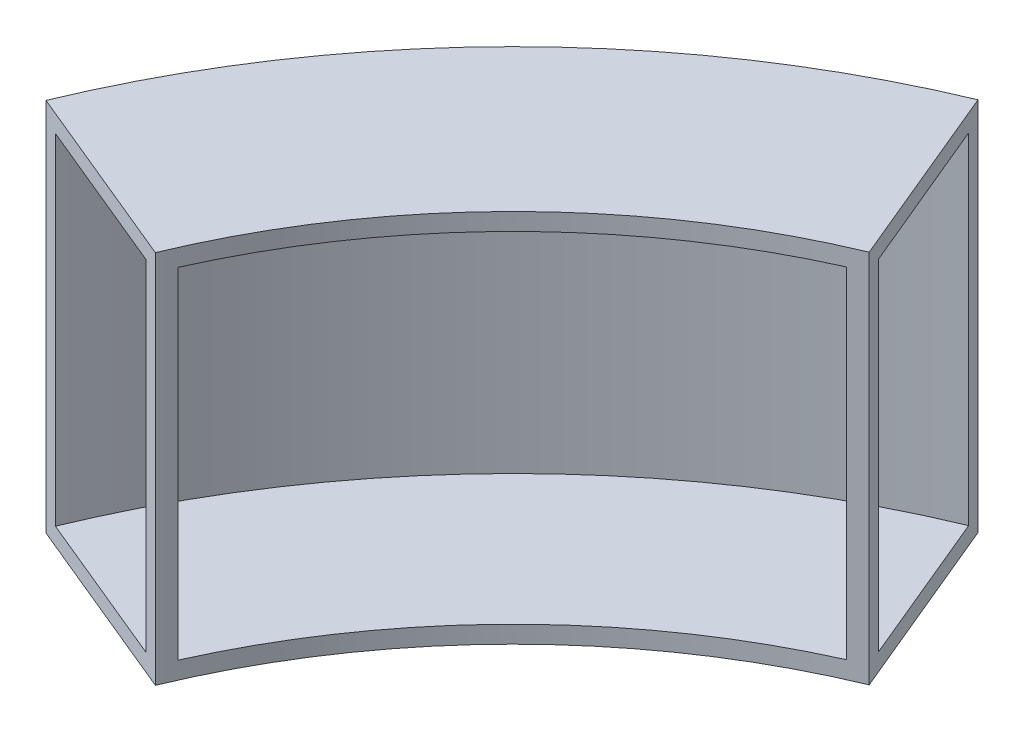
ISO-10303-21;
HEADER;
FILE_DESCRIPTION(('STEP AP214'),'2;1');
FILE_NAME('part.step','',(''),(''),'','','');
FILE_SCHEMA(('AUTOMOTIVE_DESIGN { 1 0 10303 214 1 1 1 1 }'));
ENDSEC;
DATA;
#1=APPLICATION_CONTEXT('core data for automotive mechanical design processes');
#2=APPLICATION_PROTOCOL_DEFINITION('international standard','automotive_design',2000,#1);
#3=PRODUCT_CONTEXT('',#1,'mechanical');
#4=PRODUCT('Part','Part','',(#3));
#5=PRODUCT_RELATED_PRODUCT_CATEGORY('part','',(#4));
#6=PRODUCT_DEFINITION_FORMATION('','',#4);
#7=PRODUCT_DEFINITION_CONTEXT('part definition',#1,'design');
#8=PRODUCT_DEFINITION('design','',#6,#7);
#9=PRODUCT_DEFINITION_SHAPE('','',#8);
#10=(LENGTH_UNIT() NAMED_UNIT(*) SI_UNIT(.MILLI.,.METRE.));
#11=(NAMED_UNIT(*) PLANE_ANGLE_UNIT() SI_UNIT($,.RADIAN.));
#12=(NAMED_UNIT(*) SI_UNIT($,.STERADIAN.) SOLID_ANGLE_UNIT());
#13=UNCERTAINTY_MEASURE_WITH_UNIT(LENGTH_MEASURE(1.E-05),#10,'distance_accuracy_value','');
#14=(GEOMETRIC_REPRESENTATION_CONTEXT(3) GLOBAL_UNCERTAINTY_ASSIGNED_CONTEXT((#13)) GLOBAL_UNIT_ASSIGNED_CONTEXT((#10,
#11,#12)) REPRESENTATION_CONTEXT('',''));
#15=CARTESIAN_POINT('',(0.,0.,0.));
#16=DIRECTION('',(0.,0.,1.));
#17=DIRECTION('',(1.,0.,0.));
#18=AXIS2_PLACEMENT_3D('',#15,#16,#17);
#19=CARTESIAN_POINT('',(0.,650.,0.));
#20=DIRECTION('',(-0.382169076439236,0.,0.924092418004596));
#21=DIRECTION('',(0.924092418004596,0.,0.382169076439236));
#22=AXIS2_PLACEMENT_3D('',#19,#20,#21);
#23=PLANE('',#22);
#24=DIRECTION('',(-0.924092418004596,0.,-0.382169076439236));
#25=VECTOR('',#24,1.);
#26=CARTESIAN_POINT('',(0.,0.,0.));
#27=LINE('',#26,#25);
#28=CARTESIAN_POINT('',(-1058.4838251365,0.,-437.748192709739));
#29=VERTEX_POINT('',#28);
#30=CARTESIAN_POINT('',(-1382.01717482259,0.,-571.549140577935));
#31=VERTEX_POINT('',#30);
#32=EDGE_CURVE('E184',#29,#31,#27,.T.);
#33=ORIENTED_EDGE('',*,*,#32,.F.);
#34=DIRECTION('',(0.,-1.,0.));
#35=VECTOR('',#34,1.);
#36=CARTESIAN_POINT('',(-1058.4838251365,650.,-437.748192709739));
#37=LINE('',#36,#35);
#38=CARTESIAN_POINT('',(-1058.4838251365,650.,-437.748192709739));
#39=VERTEX_POINT('',#38);
#40=EDGE_CURVE('E156',#39,#29,#37,.T.);
#41=ORIENTED_EDGE('',*,*,#40,.F.);
#42=DIRECTION('',(-0.924092418004596,0.,-0.382169076439236));
#43=VECTOR('',#42,1.);
#44=CARTESIAN_POINT('',(0.,650.,0.));
#45=LINE('',#44,#43);
#46=CARTESIAN_POINT('',(-1382.01717482259,650.,-571.549140577935));
#47=VERTEX_POINT('',#46);
#48=EDGE_CURVE('E176',#39,#47,#45,.T.);
#49=ORIENTED_EDGE('',*,*,#48,.T.);
#50=DIRECTION('',(0.,-1.,0.));
#51=VECTOR('',#50,1.);
#52=CARTESIAN_POINT('',(-1382.01717482259,650.,-571.549140577935));
#53=LINE('',#52,#51);
#54=EDGE_CURVE('E168',#47,#31,#53,.T.);
#55=ORIENTED_EDGE('',*,*,#54,.T.);
#56=EDGE_LOOP('',(#33,#41,#49,#55));
#57=FACE_BOUND('',#56,.T.);
#58=DIRECTION('',(0.,-1.,0.));
#59=VECTOR('',#58,1.);
#60=CARTESIAN_POINT('',(-1086.20659767663,30.,-449.213265002916));
#61=LINE('',#60,#59);
#62=CARTESIAN_POINT('',(-1086.20659767663,620.,-449.213265002916));
#63=VERTEX_POINT('',#62);
#64=CARTESIAN_POINT('',(-1086.20659767663,30.,-449.213265002916));
#65=VERTEX_POINT('',#64);
#66=EDGE_CURVE('E239',#63,#65,#61,.T.);
#67=ORIENTED_EDGE('',*,*,#66,.T.);
#68=DIRECTION('',(0.924092418004596,0.,0.382169076439236));
#69=VECTOR('',#68,1.);
#70=CARTESIAN_POINT('',(0.,30.,0.));
#71=LINE('',#70,#69);
#72=CARTESIAN_POINT('',(-1354.29440228246,30.,-560.084068284758));
#73=VERTEX_POINT('',#72);
#74=EDGE_CURVE('E188',#73,#65,#71,.T.);
#75=ORIENTED_EDGE('',*,*,#74,.F.);
#76=DIRECTION('',(0.,-1.,0.));
#77=VECTOR('',#76,1.);
#78=CARTESIAN_POINT('',(-1354.29440228246,0.,-560.084068284758));
#79=LINE('',#78,#77);
#80=CARTESIAN_POINT('',(-1354.29440228246,620.,-560.084068284758));
#81=VERTEX_POINT('',#80);
#82=EDGE_CURVE('E202',#81,#73,#79,.T.);
#83=ORIENTED_EDGE('',*,*,#82,.F.);
#84=DIRECTION('',(-0.924092418004596,0.,-0.382169076439236));
#85=VECTOR('',#84,1.);
#86=CARTESIAN_POINT('',(0.,620.,0.));
#87=LINE('',#86,#85);
#88=EDGE_CURVE('E205',#63,#81,#87,.T.);
#89=ORIENTED_EDGE('',*,*,#88,.F.);
#90=EDGE_LOOP('',(#67,#75,#83,#89));
#91=FACE_BOUND('',#90,.T.);
#92=ADVANCED_FACE('F40',(#57,#91),#23,.T.);
#93=CARTESIAN_POINT('',(0.,650.,0.));
#94=DIRECTION('',(0.,-1.,0.));
#95=DIRECTION('',(0.,0.,-1.));
#96=AXIS2_PLACEMENT_3D('',#93,#94,#95);
#97=CYLINDRICAL_SURFACE('',#96,1145.43069990997);
#98=DIRECTION('',(0.,-1.,0.));
#99=VECTOR('',#98,1.);
#100=CARTESIAN_POINT('',(-467.635492961688,30.,-1045.62351447293));
#101=LINE('',#100,#99);
#102=CARTESIAN_POINT('',(-467.635492961688,620.,-1045.62351447293));
#103=VERTEX_POINT('',#102);
#104=CARTESIAN_POINT('',(-467.635492961688,30.,-1045.62351447293));
#105=VERTEX_POINT('',#104);
#106=EDGE_CURVE('E135',#103,#105,#101,.T.);
#107=ORIENTED_EDGE('',*,*,#106,.T.);
#108=CARTESIAN_POINT('',(0.,30.,0.));
#109=DIRECTION('',(0.,1.,0.));
#110=DIRECTION('',(0.,0.,1.));
#111=AXIS2_PLACEMENT_3D('',#108,#109,#110);
#112=CIRCLE('',#111,1145.43069990996);
#113=CARTESIAN_POINT('',(-1046.66219735342,30.,-465.30606371242));
#114=VERTEX_POINT('',#113);
#115=EDGE_CURVE('E217',#105,#114,#112,.T.);
#116=ORIENTED_EDGE('',*,*,#115,.T.);
#117=DIRECTION('',(0.,1.,0.));
#118=VECTOR('',#117,1.);
#119=CARTESIAN_POINT('',(-1046.66219735342,620.,-465.30606371242));
#120=LINE('',#119,#118);
#121=CARTESIAN_POINT('',(-1046.66219735342,620.,-465.30606371242));
#122=VERTEX_POINT('',#121);
#123=EDGE_CURVE('E226',#114,#122,#120,.T.);
#124=ORIENTED_EDGE('',*,*,#123,.T.);
#125=CARTESIAN_POINT('',(0.,620.,0.));
#126=DIRECTION('',(0.,1.,0.));
#127=DIRECTION('',(0.,0.,1.));
#128=AXIS2_PLACEMENT_3D('',#125,#126,#127);
#129=CIRCLE('',#128,1145.43069990996);
#130=EDGE_CURVE('E214',#103,#122,#129,.T.);
#131=ORIENTED_EDGE('',*,*,#130,.F.);
#132=EDGE_LOOP('',(#107,#116,#124,#131));
#133=FACE_BOUND('',#132,.T.);
#134=CARTESIAN_POINT('',(0.,0.,0.));
#135=DIRECTION('',(0.,1.,0.));
#136=DIRECTION('',(0.,0.,1.));
#137=AXIS2_PLACEMENT_3D('',#134,#135,#136);
#138=CIRCLE('',#137,1145.43069990997);
#139=CARTESIAN_POINT('',(-440.104013269852,0.,-1057.50647553573));
#140=VERTEX_POINT('',#139);
#141=EDGE_CURVE('E180',#29,#140,#138,.F.);
#142=ORIENTED_EDGE('',*,*,#141,.T.);
#143=DIRECTION('',(0.,-1.,0.));
#144=VECTOR('',#143,1.);
#145=CARTESIAN_POINT('',(-440.104013269852,650.,-1057.50647553573));
#146=LINE('',#145,#144);
#147=CARTESIAN_POINT('',(-440.104013269852,650.,-1057.50647553573));
#148=VERTEX_POINT('',#147);
#149=EDGE_CURVE('E161',#148,#140,#146,.T.);
#150=ORIENTED_EDGE('',*,*,#149,.F.);
#151=CARTESIAN_POINT('',(0.,650.,0.));
#152=DIRECTION('',(0.,1.,0.));
#153=DIRECTION('',(0.,0.,1.));
#154=AXIS2_PLACEMENT_3D('',#151,#152,#153);
#155=CIRCLE('',#154,1145.43069990997);
#156=EDGE_CURVE('E194',#39,#148,#155,.F.);
#157=ORIENTED_EDGE('',*,*,#156,.F.);
#158=ORIENTED_EDGE('',*,*,#40,.T.);
#159=EDGE_LOOP('',(#142,#150,#157,#158));
#160=FACE_BOUND('',#159,.T.);
#161=ADVANCED_FACE('F257',(#133,#160),#97,.F.);
#162=CARTESIAN_POINT('',(0.,650.,0.));
#163=DIRECTION('',(-0.923239158526879,0.,0.384225787997865));
#164=DIRECTION('',(0.384225787997865,0.,0.923239158526879));
#165=AXIS2_PLACEMENT_3D('',#162,#163,#164);
#166=PLANE('',#165);
#167=DIRECTION('',(0.384225787997865,0.,0.923239158526879));
#168=VECTOR('',#167,1.);
#169=CARTESIAN_POINT('',(0.,30.,0.));
#170=LINE('',#169,#168);
#171=CARTESIAN_POINT('',(-563.09826134239,30.,-1353.04391638748));
#172=VERTEX_POINT('',#171);
#173=CARTESIAN_POINT('',(-451.630786909788,30.,-1085.20365029154));
#174=VERTEX_POINT('',#173);
#175=EDGE_CURVE('E12',#172,#174,#170,.T.);
#176=ORIENTED_EDGE('',*,*,#175,.T.);
#177=DIRECTION('',(0.,1.,0.));
#178=VECTOR('',#177,1.);
#179=CARTESIAN_POINT('',(-451.630786909788,620.,-1085.20365029154));
#180=LINE('',#179,#178);
#181=CARTESIAN_POINT('',(-451.630786909788,620.,-1085.20365029154));
#182=VERTEX_POINT('',#181);
#183=EDGE_CURVE('E54',#174,#182,#180,.T.);
#184=ORIENTED_EDGE('',*,*,#183,.T.);
#185=DIRECTION('',(-0.384225787997865,0.,-0.923239158526879));
#186=VECTOR('',#185,1.);
#187=CARTESIAN_POINT('',(0.,620.,0.));
#188=LINE('',#187,#186);
#189=CARTESIAN_POINT('',(-563.09826134239,620.,-1353.04391638748));
#190=VERTEX_POINT('',#189);
#191=EDGE_CURVE('E150',#182,#190,#188,.T.);
#192=ORIENTED_EDGE('',*,*,#191,.T.);
#193=DIRECTION('',(0.,-1.,0.));
#194=VECTOR('',#193,1.);
#195=CARTESIAN_POINT('',(-563.09826134239,0.,-1353.04391638748));
#196=LINE('',#195,#194);
#197=EDGE_CURVE('E48',#190,#172,#196,.T.);
#198=ORIENTED_EDGE('',*,*,#197,.T.);
#199=EDGE_LOOP('',(#176,#184,#192,#198));
#200=FACE_BOUND('',#199,.T.);
#201=ORIENTED_EDGE('',*,*,#149,.T.);
#202=DIRECTION('',(-0.384225787997865,0.,-0.923239158526879));
#203=VECTOR('',#202,1.);
#204=CARTESIAN_POINT('',(0.,0.,0.));
#205=LINE('',#204,#203);
#206=CARTESIAN_POINT('',(-574.625034982326,0.,-1380.74109114329));
#207=VERTEX_POINT('',#206);
#208=EDGE_CURVE('E177',#140,#207,#205,.T.);
#209=ORIENTED_EDGE('',*,*,#208,.T.);
#210=DIRECTION('',(0.,-1.,0.));
#211=VECTOR('',#210,1.);
#212=CARTESIAN_POINT('',(-574.625034982326,650.,-1380.74109114329));
#213=LINE('',#212,#211);
#214=CARTESIAN_POINT('',(-574.625034982326,650.,-1380.74109114329));
#215=VERTEX_POINT('',#214);
#216=EDGE_CURVE('E164',#215,#207,#213,.T.);
#217=ORIENTED_EDGE('',*,*,#216,.F.);
#218=DIRECTION('',(-0.384225787997865,0.,-0.923239158526879));
#219=VECTOR('',#218,1.);
#220=CARTESIAN_POINT('',(0.,650.,0.));
#221=LINE('',#220,#219);
#222=EDGE_CURVE('E191',#148,#215,#221,.T.);
#223=ORIENTED_EDGE('',*,*,#222,.F.);
#224=EDGE_LOOP('',(#201,#209,#217,#223));
#225=FACE_BOUND('',#224,.T.);
#226=ADVANCED_FACE('F147',(#200,#225),#166,.F.);
#227=CARTESIAN_POINT('',(0.,650.,0.));
#228=DIRECTION('',(0.,-1.,0.));
#229=DIRECTION('',(0.,0.,-1.));
#230=AXIS2_PLACEMENT_3D('',#227,#228,#229);
#231=CYLINDRICAL_SURFACE('',#230,1495.54);
#232=CARTESIAN_POINT('',(0.,0.,0.));
#233=DIRECTION('',(0.,1.,0.));
#234=DIRECTION('',(0.,0.,1.));
#235=AXIS2_PLACEMENT_3D('',#232,#233,#234);
#236=CIRCLE('',#235,1495.54);
#237=EDGE_CURVE('E172',#207,#31,#236,.T.);
#238=ORIENTED_EDGE('',*,*,#237,.T.);
#239=ORIENTED_EDGE('',*,*,#54,.F.);
#240=CARTESIAN_POINT('',(0.,650.,0.));
#241=DIRECTION('',(0.,1.,0.));
#242=DIRECTION('',(0.,0.,1.));
#243=AXIS2_PLACEMENT_3D('',#240,#241,#242);
#244=CIRCLE('',#243,1495.54);
#245=EDGE_CURVE('E171',#215,#47,#244,.T.);
#246=ORIENTED_EDGE('',*,*,#245,.F.);
#247=ORIENTED_EDGE('',*,*,#216,.T.);
#248=EDGE_LOOP('',(#238,#239,#246,#247));
#249=FACE_BOUND('',#248,.T.);
#250=ADVANCED_FACE('F306',(#249),#231,.T.);
#251=CARTESIAN_POINT('',(0.,650.,0.));
#252=DIRECTION('',(0.,1.,0.));
#253=DIRECTION('',(0.,0.,1.));
#254=AXIS2_PLACEMENT_3D('',#251,#252,#253);
#255=PLANE('',#254);
#256=ORIENTED_EDGE('',*,*,#48,.F.);
#257=ORIENTED_EDGE('',*,*,#156,.T.);
#258=ORIENTED_EDGE('',*,*,#222,.T.);
#259=ORIENTED_EDGE('',*,*,#245,.T.);
#260=EDGE_LOOP('',(#256,#257,#258,#259));
#261=FACE_BOUND('',#260,.T.);
#262=ADVANCED_FACE('F302',(#261),#255,.T.);
#263=CARTESIAN_POINT('',(0.,0.,0.));
#264=DIRECTION('',(0.,1.,0.));
#265=DIRECTION('',(0.,0.,1.));
#266=AXIS2_PLACEMENT_3D('',#263,#264,#265);
#267=PLANE('',#266);
#268=ORIENTED_EDGE('',*,*,#32,.T.);
#269=ORIENTED_EDGE('',*,*,#237,.F.);
#270=ORIENTED_EDGE('',*,*,#208,.F.);
#271=ORIENTED_EDGE('',*,*,#141,.F.);
#272=EDGE_LOOP('',(#268,#269,#270,#271));
#273=FACE_BOUND('',#272,.T.);
#274=ADVANCED_FACE('F284',(#273),#267,.F.);
#275=CARTESIAN_POINT('',(-1086.20659767663,30.,-449.213265002916));
#276=DIRECTION('',(0.,-1.,0.));
#277=DIRECTION('',(0.,0.,-1.));
#278=AXIS2_PLACEMENT_3D('',#275,#276,#277);
#279=PLANE('',#278);
#280=DIRECTION('',(-0.408261707145133,0.,-0.912864928934693));
#281=VECTOR('',#280,1.);
#282=CARTESIAN_POINT('',(-479.883344176042,30.,-1073.00946234097));
#283=LINE('',#282,#281);
#284=CARTESIAN_POINT('',(-479.883344176042,30.,-1073.00946234097));
#285=VERTEX_POINT('',#284);
#286=EDGE_CURVE('E142',#105,#285,#283,.T.);
#287=ORIENTED_EDGE('',*,*,#286,.T.);
#288=CARTESIAN_POINT('',(0.,30.,0.));
#289=DIRECTION('',(0.,-1.,0.));
#290=DIRECTION('',(0.,0.,-1.));
#291=AXIS2_PLACEMENT_3D('',#288,#289,#290);
#292=CIRCLE('',#291,1175.43069990997);
#293=EDGE_CURVE('E129',#285,#174,#292,.T.);
#294=ORIENTED_EDGE('',*,*,#293,.T.);
#295=ORIENTED_EDGE('',*,*,#175,.F.);
#296=CARTESIAN_POINT('',(0.,30.,0.));
#297=DIRECTION('',(0.,-1.,0.));
#298=DIRECTION('',(0.,0.,-1.));
#299=AXIS2_PLACEMENT_3D('',#296,#297,#298);
#300=CIRCLE('',#299,1465.54);
#301=EDGE_CURVE('E208',#73,#172,#300,.T.);
#302=ORIENTED_EDGE('',*,*,#301,.F.);
#303=ORIENTED_EDGE('',*,*,#74,.T.);
#304=CARTESIAN_POINT('',(0.,30.,0.));
#305=DIRECTION('',(0.,1.,0.));
#306=DIRECTION('',(0.,0.,1.));
#307=AXIS2_PLACEMENT_3D('',#304,#305,#306);
#308=CIRCLE('',#307,1175.43069990996);
#309=CARTESIAN_POINT('',(-1074.07534938703,30.,-477.492904795403));
#310=VERTEX_POINT('',#309);
#311=EDGE_CURVE('E62',#310,#65,#308,.T.);
#312=ORIENTED_EDGE('',*,*,#311,.F.);
#313=DIRECTION('',(0.913771734453852,0.,0.406228036099429));
#314=VECTOR('',#313,1.);
#315=CARTESIAN_POINT('',(-1046.66219735342,30.,-465.30606371242));
#316=LINE('',#315,#314);
#317=EDGE_CURVE('E230',#310,#114,#316,.T.);
#318=ORIENTED_EDGE('',*,*,#317,.T.);
#319=ORIENTED_EDGE('',*,*,#115,.F.);
#320=EDGE_LOOP('',(#287,#294,#295,#302,#303,#312,#318,#319));
#321=FACE_BOUND('',#320,.T.);
#322=ADVANCED_FACE('F138',(#321),#279,.F.);
#323=CARTESIAN_POINT('',(0.,0.,0.));
#324=DIRECTION('',(0.,-1.,0.));
#325=DIRECTION('',(0.,0.,-1.));
#326=AXIS2_PLACEMENT_3D('',#323,#324,#325);
#327=CYLINDRICAL_SURFACE('',#326,1465.54);
#328=ORIENTED_EDGE('',*,*,#82,.T.);
#329=ORIENTED_EDGE('',*,*,#301,.T.);
#330=ORIENTED_EDGE('',*,*,#197,.F.);
#331=CARTESIAN_POINT('',(0.,620.,0.));
#332=DIRECTION('',(0.,-1.,0.));
#333=DIRECTION('',(0.,0.,-1.));
#334=AXIS2_PLACEMENT_3D('',#331,#332,#333);
#335=CIRCLE('',#334,1465.54);
#336=EDGE_CURVE('E211',#81,#190,#335,.T.);
#337=ORIENTED_EDGE('',*,*,#336,.F.);
#338=EDGE_LOOP('',(#328,#329,#330,#337));
#339=FACE_BOUND('',#338,.T.);
#340=ADVANCED_FACE('F276',(#339),#327,.F.);
#341=CARTESIAN_POINT('',(-1354.29440228246,620.,-560.084068284758));
#342=DIRECTION('',(0.,1.,0.));
#343=DIRECTION('',(0.,0.,1.));
#344=AXIS2_PLACEMENT_3D('',#341,#342,#343);
#345=PLANE('',#344);
#346=ORIENTED_EDGE('',*,*,#191,.F.);
#347=CARTESIAN_POINT('',(0.,620.,0.));
#348=DIRECTION('',(0.,-1.,0.));
#349=DIRECTION('',(0.,0.,-1.));
#350=AXIS2_PLACEMENT_3D('',#347,#348,#349);
#351=CIRCLE('',#350,1175.43069990997);
#352=CARTESIAN_POINT('',(-479.883344176042,620.,-1073.00946234097));
#353=VERTEX_POINT('',#352);
#354=EDGE_CURVE('E132',#353,#182,#351,.T.);
#355=ORIENTED_EDGE('',*,*,#354,.F.);
#356=DIRECTION('',(0.408261707145133,0.,0.912864928934693));
#357=VECTOR('',#356,1.);
#358=CARTESIAN_POINT('',(-467.635492961688,620.,-1045.62351447293));
#359=LINE('',#358,#357);
#360=EDGE_CURVE('E144',#353,#103,#359,.T.);
#361=ORIENTED_EDGE('',*,*,#360,.T.);
#362=ORIENTED_EDGE('',*,*,#130,.T.);
#363=DIRECTION('',(-0.913771734453852,0.,-0.406228036099429));
#364=VECTOR('',#363,1.);
#365=CARTESIAN_POINT('',(-1074.07534938703,620.,-477.492904795403));
#366=LINE('',#365,#364);
#367=CARTESIAN_POINT('',(-1074.07534938703,620.,-477.492904795403));
#368=VERTEX_POINT('',#367);
#369=EDGE_CURVE('E236',#122,#368,#366,.T.);
#370=ORIENTED_EDGE('',*,*,#369,.T.);
#371=CARTESIAN_POINT('',(0.,620.,0.));
#372=DIRECTION('',(0.,1.,0.));
#373=DIRECTION('',(0.,0.,1.));
#374=AXIS2_PLACEMENT_3D('',#371,#372,#373);
#375=CIRCLE('',#374,1175.43069990996);
#376=EDGE_CURVE('E222',#368,#63,#375,.T.);
#377=ORIENTED_EDGE('',*,*,#376,.T.);
#378=ORIENTED_EDGE('',*,*,#88,.T.);
#379=ORIENTED_EDGE('',*,*,#336,.T.);
#380=EDGE_LOOP('',(#346,#355,#361,#362,#370,#377,#378,#379));
#381=FACE_BOUND('',#380,.T.);
#382=ADVANCED_FACE('F269',(#381),#345,.F.);
#383=CARTESIAN_POINT('',(0.,0.,0.));
#384=DIRECTION('',(0.,1.,0.));
#385=DIRECTION('',(0.,0.,1.));
#386=AXIS2_PLACEMENT_3D('',#383,#384,#385);
#387=CYLINDRICAL_SURFACE('',#386,1175.43069990996);
#388=DIRECTION('',(0.,-1.,0.));
#389=VECTOR('',#388,1.);
#390=CARTESIAN_POINT('',(-1074.07534938703,30.,-477.492904795403));
#391=LINE('',#390,#389);
#392=EDGE_CURVE('E233',#368,#310,#391,.T.);
#393=ORIENTED_EDGE('',*,*,#392,.T.);
#394=ORIENTED_EDGE('',*,*,#311,.T.);
#395=ORIENTED_EDGE('',*,*,#66,.F.);
#396=ORIENTED_EDGE('',*,*,#376,.F.);
#397=EDGE_LOOP('',(#393,#394,#395,#396));
#398=FACE_BOUND('',#397,.T.);
#399=ADVANCED_FACE('F272',(#398),#387,.T.);
#400=CARTESIAN_POINT('',(4.28453532979553E-13,0.,-9.63765897900214E-13));
#401=DIRECTION('',(0.406228036099429,0.,-0.913771734453852));
#402=DIRECTION('',(-0.913771734453852,0.,-0.406228036099429));
#403=AXIS2_PLACEMENT_3D('',#400,#401,#402);
#404=PLANE('',#403);
#405=ORIENTED_EDGE('',*,*,#369,.F.);
#406=ORIENTED_EDGE('',*,*,#123,.F.);
#407=ORIENTED_EDGE('',*,*,#317,.F.);
#408=ORIENTED_EDGE('',*,*,#392,.F.);
#409=EDGE_LOOP('',(#405,#406,#407,#408));
#410=FACE_BOUND('',#409,.T.);
#411=ADVANCED_FACE('F266',(#410),#404,.T.);
#412=CARTESIAN_POINT('',(0.,0.,0.));
#413=DIRECTION('',(0.,-1.,0.));
#414=DIRECTION('',(0.,0.,-1.));
#415=AXIS2_PLACEMENT_3D('',#412,#413,#414);
#416=CYLINDRICAL_SURFACE('',#415,1175.43069990997);
#417=ORIENTED_EDGE('',*,*,#293,.F.);
#418=DIRECTION('',(0.,1.,0.));
#419=VECTOR('',#418,1.);
#420=CARTESIAN_POINT('',(-479.883344176042,620.,-1073.00946234097));
#421=LINE('',#420,#419);
#422=EDGE_CURVE('E248',#285,#353,#421,.T.);
#423=ORIENTED_EDGE('',*,*,#422,.T.);
#424=ORIENTED_EDGE('',*,*,#354,.T.);
#425=ORIENTED_EDGE('',*,*,#183,.F.);
#426=EDGE_LOOP('',(#417,#423,#424,#425));
#427=FACE_BOUND('',#426,.T.);
#428=ADVANCED_FACE('F128',(#427),#416,.T.);
#429=CARTESIAN_POINT('',(0.,0.,0.));
#430=DIRECTION('',(-0.912864928934693,0.,0.408261707145133));
#431=DIRECTION('',(0.408261707145133,0.,0.912864928934693));
#432=AXIS2_PLACEMENT_3D('',#429,#430,#431);
#433=PLANE('',#432);
#434=ORIENTED_EDGE('',*,*,#106,.F.);
#435=ORIENTED_EDGE('',*,*,#360,.F.);
#436=ORIENTED_EDGE('',*,*,#422,.F.);
#437=ORIENTED_EDGE('',*,*,#286,.F.);
#438=EDGE_LOOP('',(#434,#435,#436,#437));
#439=FACE_BOUND('',#438,.T.);
#440=ADVANCED_FACE('F352',(#439),#433,.T.);
#441=CLOSED_SHELL('',(#92,#161,#226,#250,#262,#274,#322,#340,#382,#399,#411,#428,#440));
#442=MANIFOLD_SOLID_BREP('B2',#441);
#443=ADVANCED_BREP_SHAPE_REPRESENTATION('',(#18,#442),#14);
#444=SHAPE_DEFINITION_REPRESENTATION(#9,#443);
ENDSEC;
END-ISO-10303-21;
